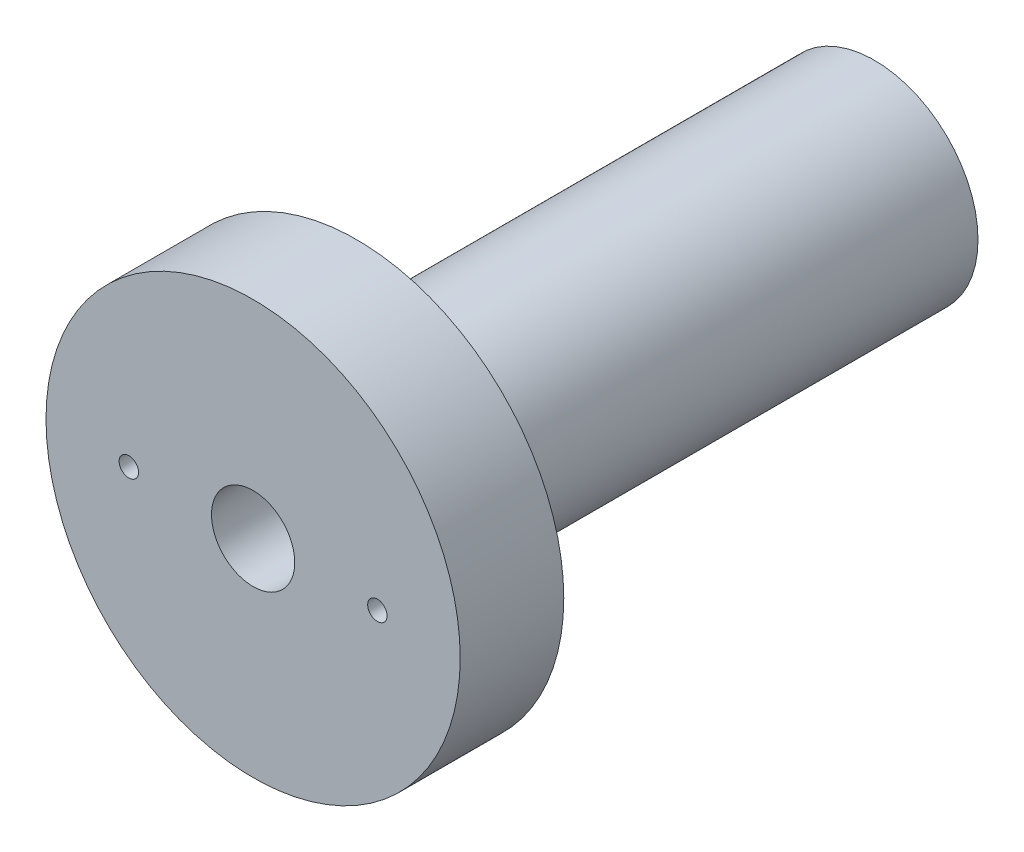
ISO-10303-21;
HEADER;
FILE_DESCRIPTION(('STEP AP214'),'2;1');
FILE_NAME('part.step','',(''),(''),'','','');
FILE_SCHEMA(('AUTOMOTIVE_DESIGN { 1 0 10303 214 1 1 1 1 }'));
ENDSEC;
DATA;
#1=APPLICATION_CONTEXT('core data for automotive mechanical design processes');
#2=APPLICATION_PROTOCOL_DEFINITION('international standard','automotive_design',2000,#1);
#3=PRODUCT_CONTEXT('',#1,'mechanical');
#4=PRODUCT('Part','Part','',(#3));
#5=PRODUCT_RELATED_PRODUCT_CATEGORY('part','',(#4));
#6=PRODUCT_DEFINITION_FORMATION('','',#4);
#7=PRODUCT_DEFINITION_CONTEXT('part definition',#1,'design');
#8=PRODUCT_DEFINITION('design','',#6,#7);
#9=PRODUCT_DEFINITION_SHAPE('','',#8);
#10=(LENGTH_UNIT() NAMED_UNIT(*) SI_UNIT(.MILLI.,.METRE.));
#11=(NAMED_UNIT(*) PLANE_ANGLE_UNIT() SI_UNIT($,.RADIAN.));
#12=(NAMED_UNIT(*) SI_UNIT($,.STERADIAN.) SOLID_ANGLE_UNIT());
#13=UNCERTAINTY_MEASURE_WITH_UNIT(LENGTH_MEASURE(1.E-05),#10,'distance_accuracy_value','');
#14=(GEOMETRIC_REPRESENTATION_CONTEXT(3) GLOBAL_UNCERTAINTY_ASSIGNED_CONTEXT((#13)) GLOBAL_UNIT_ASSIGNED_CONTEXT((#10,
#11,#12)) REPRESENTATION_CONTEXT('',''));
#15=CARTESIAN_POINT('',(0.,0.,0.));
#16=DIRECTION('',(0.,0.,1.));
#17=DIRECTION('',(1.,0.,0.));
#18=AXIS2_PLACEMENT_3D('',#15,#16,#17);
#19=CARTESIAN_POINT('',(0.,0.,0.));
#20=DIRECTION('',(0.,0.,1.));
#21=DIRECTION('',(1.,0.,0.));
#22=AXIS2_PLACEMENT_3D('',#19,#20,#21);
#23=PLANE('',#22);
#24=CARTESIAN_POINT('',(0.,0.,0.));
#25=DIRECTION('',(0.,0.,1.));
#26=DIRECTION('',(1.,0.,0.));
#27=AXIS2_PLACEMENT_3D('',#24,#25,#26);
#28=CIRCLE('',#27,2.55269999999999);
#29=CARTESIAN_POINT('',(2.55269999999999,0.,0.));
#30=VERTEX_POINT('',#29);
#31=EDGE_CURVE('E65',#30,#30,#28,.T.);
#32=ORIENTED_EDGE('',*,*,#31,.T.);
#33=EDGE_LOOP('',(#32));
#34=FACE_BOUND('',#33,.T.);
#35=CARTESIAN_POINT('',(0.,0.,0.));
#36=DIRECTION('',(0.,0.,1.));
#37=DIRECTION('',(1.,0.,0.));
#38=AXIS2_PLACEMENT_3D('',#35,#36,#37);
#39=CIRCLE('',#38,6.35);
#40=CARTESIAN_POINT('',(6.35,0.,0.));
#41=VERTEX_POINT('',#40);
#42=EDGE_CURVE('E39',#41,#41,#39,.T.);
#43=ORIENTED_EDGE('',*,*,#42,.F.);
#44=EDGE_LOOP('',(#43));
#45=FACE_BOUND('',#44,.T.);
#46=ADVANCED_FACE('F35',(#34,#45),#23,.F.);
#47=CARTESIAN_POINT('',(0.,0.,31.75));
#48=DIRECTION('',(0.,0.,-1.));
#49=DIRECTION('',(-1.,0.,0.));
#50=AXIS2_PLACEMENT_3D('',#47,#48,#49);
#51=CYLINDRICAL_SURFACE('',#50,6.35);
#52=CARTESIAN_POINT('',(0.,0.,31.75));
#53=DIRECTION('',(0.,0.,1.));
#54=DIRECTION('',(1.,0.,0.));
#55=AXIS2_PLACEMENT_3D('',#52,#53,#54);
#56=CIRCLE('',#55,6.35);
#57=CARTESIAN_POINT('',(6.35,0.,31.75));
#58=VERTEX_POINT('',#57);
#59=EDGE_CURVE('E10',#58,#58,#56,.T.);
#60=ORIENTED_EDGE('',*,*,#59,.F.);
#61=EDGE_LOOP('',(#60));
#62=FACE_BOUND('',#61,.T.);
#63=ORIENTED_EDGE('',*,*,#42,.T.);
#64=EDGE_LOOP('',(#63));
#65=FACE_BOUND('',#64,.T.);
#66=ADVANCED_FACE('F37',(#62,#65),#51,.T.);
#67=CARTESIAN_POINT('',(0.,0.,31.75));
#68=DIRECTION('',(0.,0.,1.));
#69=DIRECTION('',(1.,0.,0.));
#70=AXIS2_PLACEMENT_3D('',#67,#68,#69);
#71=PLANE('',#70);
#72=CARTESIAN_POINT('',(7.62,0.,31.75));
#73=DIRECTION('',(0.,0.,1.));
#74=DIRECTION('',(1.,0.,0.));
#75=AXIS2_PLACEMENT_3D('',#72,#73,#74);
#76=CIRCLE('',#75,0.595312499999999);
#77=CARTESIAN_POINT('',(8.2153125,0.,31.75));
#78=VERTEX_POINT('',#77);
#79=EDGE_CURVE('E59',#78,#78,#76,.T.);
#80=ORIENTED_EDGE('',*,*,#79,.T.);
#81=EDGE_LOOP('',(#80));
#82=FACE_BOUND('',#81,.T.);
#83=CARTESIAN_POINT('',(-7.62,0.,31.75));
#84=DIRECTION('',(0.,0.,1.));
#85=DIRECTION('',(1.,0.,0.));
#86=AXIS2_PLACEMENT_3D('',#83,#84,#85);
#87=CIRCLE('',#86,0.5953125);
#88=CARTESIAN_POINT('',(-7.0246875,0.,31.75));
#89=VERTEX_POINT('',#88);
#90=EDGE_CURVE('E51',#89,#89,#87,.T.);
#91=ORIENTED_EDGE('',*,*,#90,.T.);
#92=EDGE_LOOP('',(#91));
#93=FACE_BOUND('',#92,.T.);
#94=CARTESIAN_POINT('',(0.,0.,31.75));
#95=DIRECTION('',(0.,0.,1.));
#96=DIRECTION('',(1.,0.,0.));
#97=AXIS2_PLACEMENT_3D('',#94,#95,#96);
#98=CIRCLE('',#97,12.7);
#99=CARTESIAN_POINT('',(12.7,0.,31.75));
#100=VERTEX_POINT('',#99);
#101=EDGE_CURVE('E48',#100,#100,#98,.T.);
#102=ORIENTED_EDGE('',*,*,#101,.F.);
#103=EDGE_LOOP('',(#102));
#104=FACE_BOUND('',#103,.T.);
#105=ORIENTED_EDGE('',*,*,#59,.T.);
#106=EDGE_LOOP('',(#105));
#107=FACE_BOUND('',#106,.T.);
#108=ADVANCED_FACE('F78',(#82,#93,#104,#107),#71,.F.);
#109=CARTESIAN_POINT('',(0.,0.,38.1));
#110=DIRECTION('',(0.,0.,1.));
#111=DIRECTION('',(1.,0.,0.));
#112=AXIS2_PLACEMENT_3D('',#109,#110,#111);
#113=PLANE('',#112);
#114=CARTESIAN_POINT('',(0.,0.,38.1));
#115=DIRECTION('',(0.,0.,1.));
#116=DIRECTION('',(1.,0.,0.));
#117=AXIS2_PLACEMENT_3D('',#114,#115,#116);
#118=CIRCLE('',#117,2.55269999999999);
#119=CARTESIAN_POINT('',(2.55269999999999,0.,38.1));
#120=VERTEX_POINT('',#119);
#121=EDGE_CURVE('E68',#120,#120,#118,.T.);
#122=ORIENTED_EDGE('',*,*,#121,.F.);
#123=EDGE_LOOP('',(#122));
#124=FACE_BOUND('',#123,.T.);
#125=CARTESIAN_POINT('',(7.62,0.,38.1));
#126=DIRECTION('',(0.,0.,1.));
#127=DIRECTION('',(1.,0.,0.));
#128=AXIS2_PLACEMENT_3D('',#125,#126,#127);
#129=CIRCLE('',#128,0.595312499999999);
#130=CARTESIAN_POINT('',(8.2153125,0.,38.1));
#131=VERTEX_POINT('',#130);
#132=EDGE_CURVE('E62',#131,#131,#129,.T.);
#133=ORIENTED_EDGE('',*,*,#132,.F.);
#134=EDGE_LOOP('',(#133));
#135=FACE_BOUND('',#134,.T.);
#136=CARTESIAN_POINT('',(-7.62,0.,38.1));
#137=DIRECTION('',(0.,0.,1.));
#138=DIRECTION('',(1.,0.,0.));
#139=AXIS2_PLACEMENT_3D('',#136,#137,#138);
#140=CIRCLE('',#139,0.5953125);
#141=CARTESIAN_POINT('',(-7.0246875,0.,38.1));
#142=VERTEX_POINT('',#141);
#143=EDGE_CURVE('E56',#142,#142,#140,.T.);
#144=ORIENTED_EDGE('',*,*,#143,.F.);
#145=EDGE_LOOP('',(#144));
#146=FACE_BOUND('',#145,.T.);
#147=CARTESIAN_POINT('',(0.,0.,38.1));
#148=DIRECTION('',(0.,0.,1.));
#149=DIRECTION('',(1.,0.,0.));
#150=AXIS2_PLACEMENT_3D('',#147,#148,#149);
#151=CIRCLE('',#150,12.7);
#152=CARTESIAN_POINT('',(12.7,0.,38.1));
#153=VERTEX_POINT('',#152);
#154=EDGE_CURVE('E46',#153,#153,#151,.T.);
#155=ORIENTED_EDGE('',*,*,#154,.T.);
#156=EDGE_LOOP('',(#155));
#157=FACE_BOUND('',#156,.T.);
#158=ADVANCED_FACE('F74',(#124,#135,#146,#157),#113,.T.);
#159=CARTESIAN_POINT('',(0.,0.,38.1));
#160=DIRECTION('',(0.,0.,-1.));
#161=DIRECTION('',(-1.,0.,0.));
#162=AXIS2_PLACEMENT_3D('',#159,#160,#161);
#163=CYLINDRICAL_SURFACE('',#162,12.7);
#164=ORIENTED_EDGE('',*,*,#154,.F.);
#165=EDGE_LOOP('',(#164));
#166=FACE_BOUND('',#165,.T.);
#167=ORIENTED_EDGE('',*,*,#101,.T.);
#168=EDGE_LOOP('',(#167));
#169=FACE_BOUND('',#168,.T.);
#170=ADVANCED_FACE('F77',(#166,#169),#163,.T.);
#171=CARTESIAN_POINT('',(-7.62,0.,0.));
#172=DIRECTION('',(0.,0.,1.));
#173=DIRECTION('',(1.,0.,0.));
#174=AXIS2_PLACEMENT_3D('',#171,#172,#173);
#175=CYLINDRICAL_SURFACE('',#174,0.5953125);
#176=ORIENTED_EDGE('',*,*,#143,.T.);
#177=EDGE_LOOP('',(#176));
#178=FACE_BOUND('',#177,.T.);
#179=ORIENTED_EDGE('',*,*,#90,.F.);
#180=EDGE_LOOP('',(#179));
#181=FACE_BOUND('',#180,.T.);
#182=ADVANCED_FACE('F88',(#178,#181),#175,.F.);
#183=CARTESIAN_POINT('',(7.62,0.,0.));
#184=DIRECTION('',(0.,0.,1.));
#185=DIRECTION('',(1.,0.,0.));
#186=AXIS2_PLACEMENT_3D('',#183,#184,#185);
#187=CYLINDRICAL_SURFACE('',#186,0.595312499999999);
#188=ORIENTED_EDGE('',*,*,#132,.T.);
#189=EDGE_LOOP('',(#188));
#190=FACE_BOUND('',#189,.T.);
#191=ORIENTED_EDGE('',*,*,#79,.F.);
#192=EDGE_LOOP('',(#191));
#193=FACE_BOUND('',#192,.T.);
#194=ADVANCED_FACE('F110',(#190,#193),#187,.F.);
#195=CARTESIAN_POINT('',(0.,0.,38.1));
#196=DIRECTION('',(0.,0.,1.));
#197=DIRECTION('',(1.,0.,0.));
#198=AXIS2_PLACEMENT_3D('',#195,#196,#197);
#199=CYLINDRICAL_SURFACE('',#198,2.55269999999999);
#200=ORIENTED_EDGE('',*,*,#31,.F.);
#201=EDGE_LOOP('',(#200));
#202=FACE_BOUND('',#201,.T.);
#203=ORIENTED_EDGE('',*,*,#121,.T.);
#204=EDGE_LOOP('',(#203));
#205=FACE_BOUND('',#204,.T.);
#206=ADVANCED_FACE('F72',(#202,#205),#199,.F.);
#207=CLOSED_SHELL('',(#46,#66,#108,#158,#170,#182,#194,#206));
#208=MANIFOLD_SOLID_BREP('B2',#207);
#209=ADVANCED_BREP_SHAPE_REPRESENTATION('',(#18,#208),#14);
#210=SHAPE_DEFINITION_REPRESENTATION(#9,#209);
ENDSEC;
END-ISO-10303-21;
